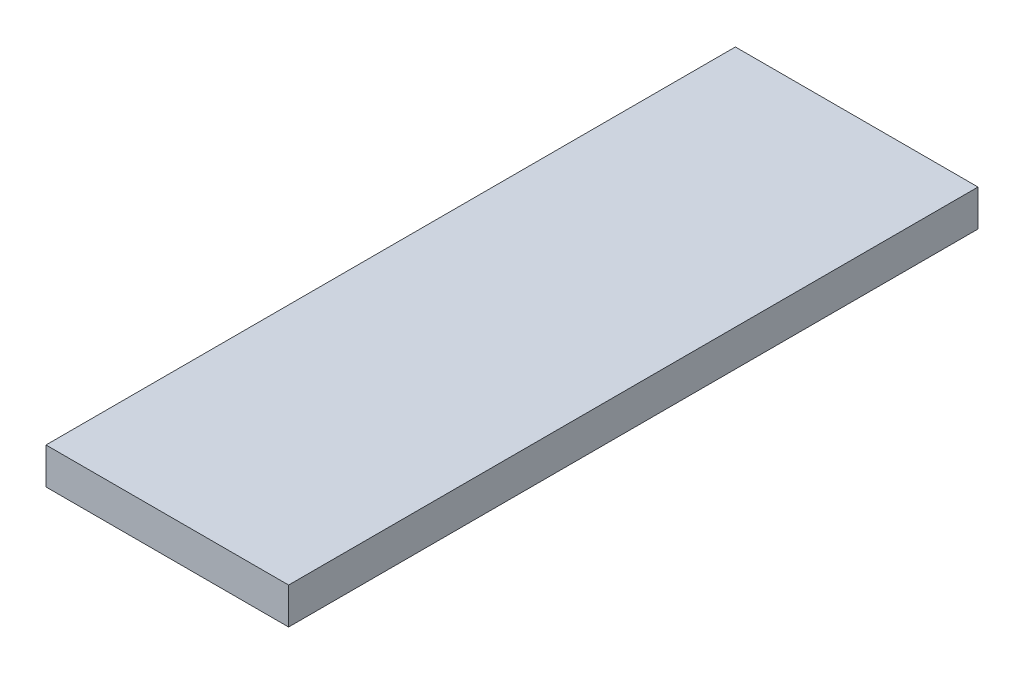
ISO-10303-21;
HEADER;
FILE_DESCRIPTION(('STEP AP214'),'2;1');
FILE_NAME('part.step','',(''),(''),'','','');
FILE_SCHEMA(('AUTOMOTIVE_DESIGN { 1 0 10303 214 1 1 1 1 }'));
ENDSEC;
DATA;
#1=APPLICATION_CONTEXT('core data for automotive mechanical design processes');
#2=APPLICATION_PROTOCOL_DEFINITION('international standard','automotive_design',2000,#1);
#3=PRODUCT_CONTEXT('',#1,'mechanical');
#4=PRODUCT('Part','Part','',(#3));
#5=PRODUCT_RELATED_PRODUCT_CATEGORY('part','',(#4));
#6=PRODUCT_DEFINITION_FORMATION('','',#4);
#7=PRODUCT_DEFINITION_CONTEXT('part definition',#1,'design');
#8=PRODUCT_DEFINITION('design','',#6,#7);
#9=PRODUCT_DEFINITION_SHAPE('','',#8);
#10=(LENGTH_UNIT() NAMED_UNIT(*) SI_UNIT(.MILLI.,.METRE.));
#11=(NAMED_UNIT(*) PLANE_ANGLE_UNIT() SI_UNIT($,.RADIAN.));
#12=(NAMED_UNIT(*) SI_UNIT($,.STERADIAN.) SOLID_ANGLE_UNIT());
#13=UNCERTAINTY_MEASURE_WITH_UNIT(LENGTH_MEASURE(1.E-05),#10,'distance_accuracy_value','');
#14=(GEOMETRIC_REPRESENTATION_CONTEXT(3) GLOBAL_UNCERTAINTY_ASSIGNED_CONTEXT((#13)) GLOBAL_UNIT_ASSIGNED_CONTEXT((#10,
#11,#12)) REPRESENTATION_CONTEXT('',''));
#15=CARTESIAN_POINT('',(0.,0.,0.));
#16=DIRECTION('',(0.,0.,1.));
#17=DIRECTION('',(1.,0.,0.));
#18=AXIS2_PLACEMENT_3D('',#15,#16,#17);
#19=CARTESIAN_POINT('',(-10.,3.,28.415));
#20=DIRECTION('',(1.,0.,0.));
#21=DIRECTION('',(0.,0.,1.));
#22=AXIS2_PLACEMENT_3D('',#19,#20,#21);
#23=PLANE('',#22);
#24=DIRECTION('',(0.,1.,0.));
#25=VECTOR('',#24,1.);
#26=CARTESIAN_POINT('',(-10.,3.,-28.415));
#27=LINE('',#26,#25);
#28=CARTESIAN_POINT('',(-10.,0.,-28.415));
#29=VERTEX_POINT('',#28);
#30=CARTESIAN_POINT('',(-10.,3.,-28.415));
#31=VERTEX_POINT('',#30);
#32=EDGE_CURVE('E11',#29,#31,#27,.T.);
#33=ORIENTED_EDGE('',*,*,#32,.F.);
#34=DIRECTION('',(0.,0.,-1.));
#35=VECTOR('',#34,1.);
#36=CARTESIAN_POINT('',(-10.,0.,0.));
#37=LINE('',#36,#35);
#38=CARTESIAN_POINT('',(-10.,0.,28.415));
#39=VERTEX_POINT('',#38);
#40=EDGE_CURVE('E102',#29,#39,#37,.F.);
#41=ORIENTED_EDGE('',*,*,#40,.T.);
#42=DIRECTION('',(0.,1.,0.));
#43=VECTOR('',#42,1.);
#44=CARTESIAN_POINT('',(-10.,3.,28.415));
#45=LINE('',#44,#43);
#46=CARTESIAN_POINT('',(-10.,3.,28.415));
#47=VERTEX_POINT('',#46);
#48=EDGE_CURVE('E57',#39,#47,#45,.T.);
#49=ORIENTED_EDGE('',*,*,#48,.T.);
#50=DIRECTION('',(0.,0.,1.));
#51=VECTOR('',#50,1.);
#52=CARTESIAN_POINT('',(-10.,3.,28.415));
#53=LINE('',#52,#51);
#54=EDGE_CURVE('E123',#31,#47,#53,.T.);
#55=ORIENTED_EDGE('',*,*,#54,.F.);
#56=EDGE_LOOP('',(#33,#41,#49,#55));
#57=FACE_BOUND('',#56,.T.);
#58=ADVANCED_FACE('F46',(#57),#23,.F.);
#59=CARTESIAN_POINT('',(-10.,3.,28.415));
#60=DIRECTION('',(0.,0.,-1.));
#61=DIRECTION('',(1.,0.,0.));
#62=AXIS2_PLACEMENT_3D('',#59,#60,#61);
#63=PLANE('',#62);
#64=ORIENTED_EDGE('',*,*,#48,.F.);
#65=DIRECTION('',(1.,0.,0.));
#66=VECTOR('',#65,1.);
#67=CARTESIAN_POINT('',(0.,0.,28.415));
#68=LINE('',#67,#66);
#69=CARTESIAN_POINT('',(10.,0.,28.415));
#70=VERTEX_POINT('',#69);
#71=EDGE_CURVE('E112',#39,#70,#68,.T.);
#72=ORIENTED_EDGE('',*,*,#71,.T.);
#73=DIRECTION('',(0.,1.,0.));
#74=VECTOR('',#73,1.);
#75=CARTESIAN_POINT('',(10.,3.,28.415));
#76=LINE('',#75,#74);
#77=CARTESIAN_POINT('',(10.,3.,28.415));
#78=VERTEX_POINT('',#77);
#79=EDGE_CURVE('E65',#70,#78,#76,.T.);
#80=ORIENTED_EDGE('',*,*,#79,.T.);
#81=DIRECTION('',(1.,0.,0.));
#82=VECTOR('',#81,1.);
#83=CARTESIAN_POINT('',(-10.,3.,28.415));
#84=LINE('',#83,#82);
#85=EDGE_CURVE('E96',#47,#78,#84,.T.);
#86=ORIENTED_EDGE('',*,*,#85,.F.);
#87=EDGE_LOOP('',(#64,#72,#80,#86));
#88=FACE_BOUND('',#87,.T.);
#89=ADVANCED_FACE('F128',(#88),#63,.F.);
#90=CARTESIAN_POINT('',(10.,3.,28.415));
#91=DIRECTION('',(-1.,0.,0.));
#92=DIRECTION('',(0.,0.,-1.));
#93=AXIS2_PLACEMENT_3D('',#90,#91,#92);
#94=PLANE('',#93);
#95=ORIENTED_EDGE('',*,*,#79,.F.);
#96=DIRECTION('',(0.,0.,-1.));
#97=VECTOR('',#96,1.);
#98=CARTESIAN_POINT('',(10.,0.,0.));
#99=LINE('',#98,#97);
#100=CARTESIAN_POINT('',(10.,0.,-28.415));
#101=VERTEX_POINT('',#100);
#102=EDGE_CURVE('E101',#70,#101,#99,.T.);
#103=ORIENTED_EDGE('',*,*,#102,.T.);
#104=DIRECTION('',(0.,1.,0.));
#105=VECTOR('',#104,1.);
#106=CARTESIAN_POINT('',(10.,3.,-28.415));
#107=LINE('',#106,#105);
#108=CARTESIAN_POINT('',(10.,3.,-28.415));
#109=VERTEX_POINT('',#108);
#110=EDGE_CURVE('E50',#101,#109,#107,.T.);
#111=ORIENTED_EDGE('',*,*,#110,.T.);
#112=DIRECTION('',(0.,0.,-1.));
#113=VECTOR('',#112,1.);
#114=CARTESIAN_POINT('',(10.,3.,28.415));
#115=LINE('',#114,#113);
#116=EDGE_CURVE('E115',#78,#109,#115,.T.);
#117=ORIENTED_EDGE('',*,*,#116,.F.);
#118=EDGE_LOOP('',(#95,#103,#111,#117));
#119=FACE_BOUND('',#118,.T.);
#120=ADVANCED_FACE('F105',(#119),#94,.F.);
#121=CARTESIAN_POINT('',(-10.,3.,-28.415));
#122=DIRECTION('',(0.,0.,1.));
#123=DIRECTION('',(-1.,0.,0.));
#124=AXIS2_PLACEMENT_3D('',#121,#122,#123);
#125=PLANE('',#124);
#126=DIRECTION('',(1.,0.,0.));
#127=VECTOR('',#126,1.);
#128=CARTESIAN_POINT('',(0.,0.,-28.415));
#129=LINE('',#128,#127);
#130=EDGE_CURVE('E89',#101,#29,#129,.F.);
#131=ORIENTED_EDGE('',*,*,#130,.T.);
#132=ORIENTED_EDGE('',*,*,#32,.T.);
#133=DIRECTION('',(-1.,0.,0.));
#134=VECTOR('',#133,1.);
#135=CARTESIAN_POINT('',(-10.,3.,-28.415));
#136=LINE('',#135,#134);
#137=EDGE_CURVE('E91',#109,#31,#136,.T.);
#138=ORIENTED_EDGE('',*,*,#137,.F.);
#139=ORIENTED_EDGE('',*,*,#110,.F.);
#140=EDGE_LOOP('',(#131,#132,#138,#139));
#141=FACE_BOUND('',#140,.T.);
#142=ADVANCED_FACE('F48',(#141),#125,.F.);
#143=CARTESIAN_POINT('',(0.,3.,0.));
#144=DIRECTION('',(0.,-1.,0.));
#145=DIRECTION('',(0.,0.,-1.));
#146=AXIS2_PLACEMENT_3D('',#143,#144,#145);
#147=PLANE('',#146);
#148=ORIENTED_EDGE('',*,*,#116,.T.);
#149=ORIENTED_EDGE('',*,*,#137,.T.);
#150=ORIENTED_EDGE('',*,*,#54,.T.);
#151=ORIENTED_EDGE('',*,*,#85,.T.);
#152=EDGE_LOOP('',(#148,#149,#150,#151));
#153=FACE_BOUND('',#152,.T.);
#154=ADVANCED_FACE('F126',(#153),#147,.F.);
#155=CARTESIAN_POINT('',(0.,0.,0.));
#156=DIRECTION('',(0.,-1.,0.));
#157=DIRECTION('',(0.,0.,-1.));
#158=AXIS2_PLACEMENT_3D('',#155,#156,#157);
#159=PLANE('',#158);
#160=ORIENTED_EDGE('',*,*,#102,.F.);
#161=ORIENTED_EDGE('',*,*,#71,.F.);
#162=ORIENTED_EDGE('',*,*,#40,.F.);
#163=ORIENTED_EDGE('',*,*,#130,.F.);
#164=EDGE_LOOP('',(#160,#161,#162,#163));
#165=FACE_BOUND('',#164,.T.);
#166=ADVANCED_FACE('F99',(#165),#159,.T.);
#167=CLOSED_SHELL('',(#58,#89,#120,#142,#154,#166));
#168=MANIFOLD_SOLID_BREP('B2',#167);
#169=ADVANCED_BREP_SHAPE_REPRESENTATION('',(#18,#168),#14);
#170=SHAPE_DEFINITION_REPRESENTATION(#9,#169);
ENDSEC;
END-ISO-10303-21;
